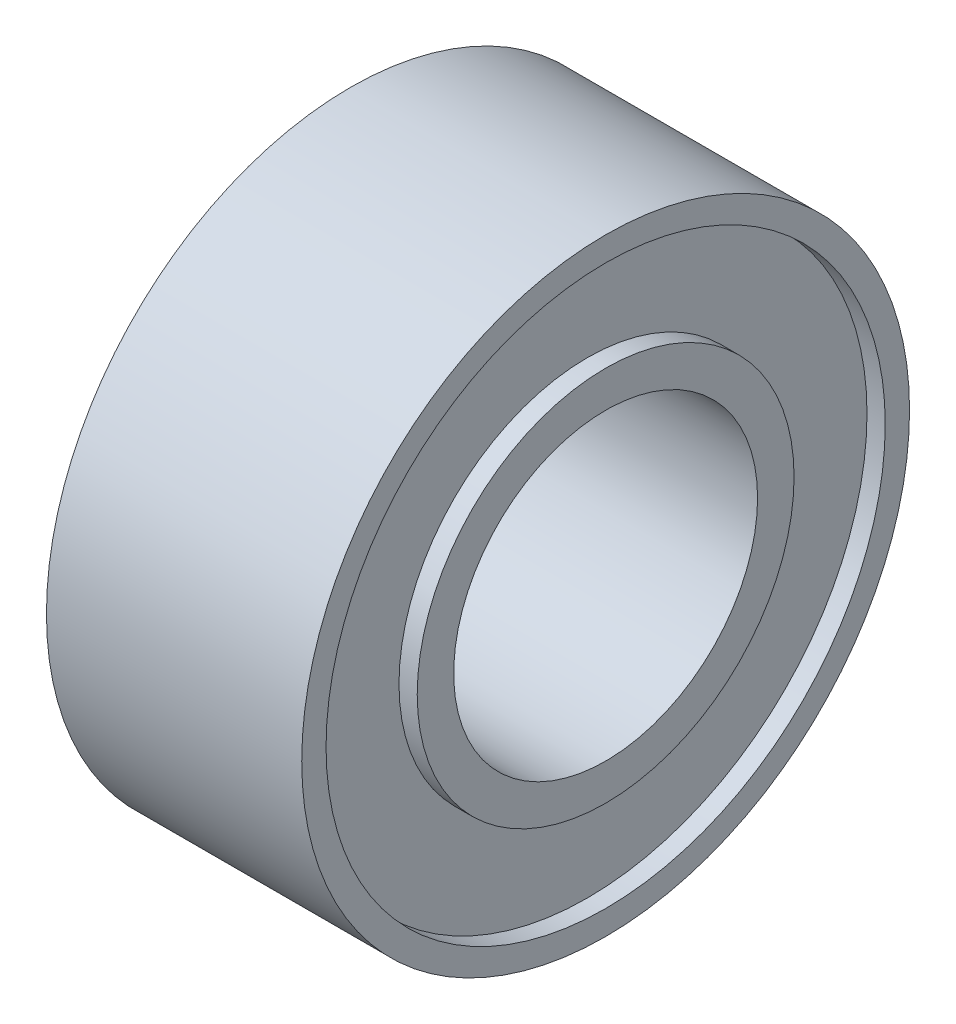
ISO-10303-21;
HEADER;
FILE_DESCRIPTION(('STEP AP214'),'2;1');
FILE_NAME('part.step','',(''),(''),'','','');
FILE_SCHEMA(('AUTOMOTIVE_DESIGN { 1 0 10303 214 1 1 1 1 }'));
ENDSEC;
DATA;
#1=APPLICATION_CONTEXT('core data for automotive mechanical design processes');
#2=APPLICATION_PROTOCOL_DEFINITION('international standard','automotive_design',2000,#1);
#3=PRODUCT_CONTEXT('',#1,'mechanical');
#4=PRODUCT('Part','Part','',(#3));
#5=PRODUCT_RELATED_PRODUCT_CATEGORY('part','',(#4));
#6=PRODUCT_DEFINITION_FORMATION('','',#4);
#7=PRODUCT_DEFINITION_CONTEXT('part definition',#1,'design');
#8=PRODUCT_DEFINITION('design','',#6,#7);
#9=PRODUCT_DEFINITION_SHAPE('','',#8);
#10=(LENGTH_UNIT() NAMED_UNIT(*) SI_UNIT(.MILLI.,.METRE.));
#11=(NAMED_UNIT(*) PLANE_ANGLE_UNIT() SI_UNIT($,.RADIAN.));
#12=(NAMED_UNIT(*) SI_UNIT($,.STERADIAN.) SOLID_ANGLE_UNIT());
#13=UNCERTAINTY_MEASURE_WITH_UNIT(LENGTH_MEASURE(1.E-05),#10,'distance_accuracy_value','');
#14=(GEOMETRIC_REPRESENTATION_CONTEXT(3) GLOBAL_UNCERTAINTY_ASSIGNED_CONTEXT((#13)) GLOBAL_UNIT_ASSIGNED_CONTEXT((#10,
#11,#12)) REPRESENTATION_CONTEXT('',''));
#15=CARTESIAN_POINT('',(0.,0.,0.));
#16=DIRECTION('',(0.,0.,1.));
#17=DIRECTION('',(1.,0.,0.));
#18=AXIS2_PLACEMENT_3D('',#15,#16,#17);
#19=CARTESIAN_POINT('',(-2.1,0.,0.));
#20=DIRECTION('',(1.,0.,0.));
#21=DIRECTION('',(0.,0.,-1.));
#22=AXIS2_PLACEMENT_3D('',#19,#20,#21);
#23=CYLINDRICAL_SURFACE('',#22,3.1);
#24=CARTESIAN_POINT('',(-2.1,0.,0.));
#25=DIRECTION('',(1.,0.,0.));
#26=DIRECTION('',(0.,0.,-1.));
#27=AXIS2_PLACEMENT_3D('',#24,#25,#26);
#28=CIRCLE('',#27,3.1);
#29=CARTESIAN_POINT('',(-2.1,0.,-3.1));
#30=VERTEX_POINT('',#29);
#31=EDGE_CURVE('E10',#30,#30,#28,.T.);
#32=ORIENTED_EDGE('',*,*,#31,.T.);
#33=EDGE_LOOP('',(#32));
#34=FACE_BOUND('',#33,.T.);
#35=CARTESIAN_POINT('',(-1.8,0.,0.));
#36=DIRECTION('',(1.,0.,0.));
#37=DIRECTION('',(0.,0.,-1.));
#38=AXIS2_PLACEMENT_3D('',#35,#36,#37);
#39=CIRCLE('',#38,3.1);
#40=CARTESIAN_POINT('',(-1.8,0.,-3.1));
#41=VERTEX_POINT('',#40);
#42=EDGE_CURVE('E71',#41,#41,#39,.T.);
#43=ORIENTED_EDGE('',*,*,#42,.F.);
#44=EDGE_LOOP('',(#43));
#45=FACE_BOUND('',#44,.T.);
#46=ADVANCED_FACE('F31',(#34,#45),#23,.T.);
#47=CARTESIAN_POINT('',(-2.1,3.1,0.));
#48=DIRECTION('',(-1.,0.,0.));
#49=DIRECTION('',(0.,0.,1.));
#50=AXIS2_PLACEMENT_3D('',#47,#48,#49);
#51=PLANE('',#50);
#52=CARTESIAN_POINT('',(-2.1,0.,0.));
#53=DIRECTION('',(1.,0.,0.));
#54=DIRECTION('',(0.,0.,-1.));
#55=AXIS2_PLACEMENT_3D('',#52,#53,#54);
#56=CIRCLE('',#55,2.5);
#57=CARTESIAN_POINT('',(-2.1,0.,-2.5));
#58=VERTEX_POINT('',#57);
#59=EDGE_CURVE('E37',#58,#58,#56,.T.);
#60=ORIENTED_EDGE('',*,*,#59,.T.);
#61=EDGE_LOOP('',(#60));
#62=FACE_BOUND('',#61,.T.);
#63=ORIENTED_EDGE('',*,*,#31,.F.);
#64=EDGE_LOOP('',(#63));
#65=FACE_BOUND('',#64,.T.);
#66=ADVANCED_FACE('F79',(#62,#65),#51,.T.);
#67=CARTESIAN_POINT('',(-2.1,0.,0.));
#68=DIRECTION('',(1.,0.,0.));
#69=DIRECTION('',(0.,0.,-1.));
#70=AXIS2_PLACEMENT_3D('',#67,#68,#69);
#71=CYLINDRICAL_SURFACE('',#70,2.5);
#72=CARTESIAN_POINT('',(2.1,0.,0.));
#73=DIRECTION('',(1.,0.,0.));
#74=DIRECTION('',(0.,0.,-1.));
#75=AXIS2_PLACEMENT_3D('',#72,#73,#74);
#76=CIRCLE('',#75,2.5);
#77=CARTESIAN_POINT('',(2.1,0.,-2.5));
#78=VERTEX_POINT('',#77);
#79=EDGE_CURVE('E41',#78,#78,#76,.T.);
#80=ORIENTED_EDGE('',*,*,#79,.T.);
#81=EDGE_LOOP('',(#80));
#82=FACE_BOUND('',#81,.T.);
#83=ORIENTED_EDGE('',*,*,#59,.F.);
#84=EDGE_LOOP('',(#83));
#85=FACE_BOUND('',#84,.T.);
#86=ADVANCED_FACE('F83',(#82,#85),#71,.F.);
#87=CARTESIAN_POINT('',(2.1,2.5,0.));
#88=DIRECTION('',(1.,0.,0.));
#89=DIRECTION('',(0.,0.,-1.));
#90=AXIS2_PLACEMENT_3D('',#87,#88,#89);
#91=PLANE('',#90);
#92=CARTESIAN_POINT('',(2.1,0.,0.));
#93=DIRECTION('',(1.,0.,0.));
#94=DIRECTION('',(0.,0.,-1.));
#95=AXIS2_PLACEMENT_3D('',#92,#93,#94);
#96=CIRCLE('',#95,3.1);
#97=CARTESIAN_POINT('',(2.1,0.,-3.1));
#98=VERTEX_POINT('',#97);
#99=EDGE_CURVE('E45',#98,#98,#96,.T.);
#100=ORIENTED_EDGE('',*,*,#99,.T.);
#101=EDGE_LOOP('',(#100));
#102=FACE_BOUND('',#101,.T.);
#103=ORIENTED_EDGE('',*,*,#79,.F.);
#104=EDGE_LOOP('',(#103));
#105=FACE_BOUND('',#104,.T.);
#106=ADVANCED_FACE('F87',(#102,#105),#91,.T.);
#107=CARTESIAN_POINT('',(-2.1,0.,0.));
#108=DIRECTION('',(1.,0.,0.));
#109=DIRECTION('',(0.,0.,-1.));
#110=AXIS2_PLACEMENT_3D('',#107,#108,#109);
#111=CYLINDRICAL_SURFACE('',#110,3.1);
#112=CARTESIAN_POINT('',(1.8,0.,0.));
#113=DIRECTION('',(1.,0.,0.));
#114=DIRECTION('',(0.,0.,-1.));
#115=AXIS2_PLACEMENT_3D('',#112,#113,#114);
#116=CIRCLE('',#115,3.1);
#117=CARTESIAN_POINT('',(1.8,0.,-3.1));
#118=VERTEX_POINT('',#117);
#119=EDGE_CURVE('E50',#118,#118,#116,.T.);
#120=ORIENTED_EDGE('',*,*,#119,.T.);
#121=EDGE_LOOP('',(#120));
#122=FACE_BOUND('',#121,.T.);
#123=ORIENTED_EDGE('',*,*,#99,.F.);
#124=EDGE_LOOP('',(#123));
#125=FACE_BOUND('',#124,.T.);
#126=ADVANCED_FACE('F94',(#122,#125),#111,.T.);
#127=CARTESIAN_POINT('',(1.8,3.1,0.));
#128=DIRECTION('',(1.,0.,0.));
#129=DIRECTION('',(0.,0.,-1.));
#130=AXIS2_PLACEMENT_3D('',#127,#128,#129);
#131=PLANE('',#130);
#132=CARTESIAN_POINT('',(1.8,0.,0.));
#133=DIRECTION('',(1.,0.,0.));
#134=DIRECTION('',(0.,0.,-1.));
#135=AXIS2_PLACEMENT_3D('',#132,#133,#134);
#136=CIRCLE('',#135,4.6);
#137=CARTESIAN_POINT('',(1.8,0.,-4.6));
#138=VERTEX_POINT('',#137);
#139=EDGE_CURVE('E53',#138,#138,#136,.T.);
#140=ORIENTED_EDGE('',*,*,#139,.T.);
#141=EDGE_LOOP('',(#140));
#142=FACE_BOUND('',#141,.T.);
#143=ORIENTED_EDGE('',*,*,#119,.F.);
#144=EDGE_LOOP('',(#143));
#145=FACE_BOUND('',#144,.T.);
#146=ADVANCED_FACE('F98',(#142,#145),#131,.T.);
#147=CARTESIAN_POINT('',(-2.1,0.,0.));
#148=DIRECTION('',(1.,0.,0.));
#149=DIRECTION('',(0.,0.,-1.));
#150=AXIS2_PLACEMENT_3D('',#147,#148,#149);
#151=CYLINDRICAL_SURFACE('',#150,4.6);
#152=CARTESIAN_POINT('',(2.1,0.,0.));
#153=DIRECTION('',(1.,0.,0.));
#154=DIRECTION('',(0.,0.,-1.));
#155=AXIS2_PLACEMENT_3D('',#152,#153,#154);
#156=CIRCLE('',#155,4.6);
#157=CARTESIAN_POINT('',(2.1,0.,-4.6));
#158=VERTEX_POINT('',#157);
#159=EDGE_CURVE('E56',#158,#158,#156,.T.);
#160=ORIENTED_EDGE('',*,*,#159,.T.);
#161=EDGE_LOOP('',(#160));
#162=FACE_BOUND('',#161,.T.);
#163=ORIENTED_EDGE('',*,*,#139,.F.);
#164=EDGE_LOOP('',(#163));
#165=FACE_BOUND('',#164,.T.);
#166=ADVANCED_FACE('F102',(#162,#165),#151,.F.);
#167=CARTESIAN_POINT('',(2.1,4.6,0.));
#168=DIRECTION('',(1.,0.,0.));
#169=DIRECTION('',(0.,0.,-1.));
#170=AXIS2_PLACEMENT_3D('',#167,#168,#169);
#171=PLANE('',#170);
#172=CARTESIAN_POINT('',(2.1,0.,0.));
#173=DIRECTION('',(1.,0.,0.));
#174=DIRECTION('',(0.,0.,-1.));
#175=AXIS2_PLACEMENT_3D('',#172,#173,#174);
#176=CIRCLE('',#175,5.);
#177=CARTESIAN_POINT('',(2.1,0.,-5.));
#178=VERTEX_POINT('',#177);
#179=EDGE_CURVE('E59',#178,#178,#176,.T.);
#180=ORIENTED_EDGE('',*,*,#179,.T.);
#181=EDGE_LOOP('',(#180));
#182=FACE_BOUND('',#181,.T.);
#183=ORIENTED_EDGE('',*,*,#159,.F.);
#184=EDGE_LOOP('',(#183));
#185=FACE_BOUND('',#184,.T.);
#186=ADVANCED_FACE('F106',(#182,#185),#171,.T.);
#187=CARTESIAN_POINT('',(-2.1,0.,0.));
#188=DIRECTION('',(1.,0.,0.));
#189=DIRECTION('',(0.,0.,-1.));
#190=AXIS2_PLACEMENT_3D('',#187,#188,#189);
#191=CYLINDRICAL_SURFACE('',#190,5.);
#192=CARTESIAN_POINT('',(-2.1,0.,0.));
#193=DIRECTION('',(1.,0.,0.));
#194=DIRECTION('',(0.,0.,-1.));
#195=AXIS2_PLACEMENT_3D('',#192,#193,#194);
#196=CIRCLE('',#195,5.);
#197=CARTESIAN_POINT('',(-2.1,0.,-5.));
#198=VERTEX_POINT('',#197);
#199=EDGE_CURVE('E62',#198,#198,#196,.T.);
#200=ORIENTED_EDGE('',*,*,#199,.T.);
#201=EDGE_LOOP('',(#200));
#202=FACE_BOUND('',#201,.T.);
#203=ORIENTED_EDGE('',*,*,#179,.F.);
#204=EDGE_LOOP('',(#203));
#205=FACE_BOUND('',#204,.T.);
#206=ADVANCED_FACE('F110',(#202,#205),#191,.T.);
#207=CARTESIAN_POINT('',(-2.1,5.,0.));
#208=DIRECTION('',(-1.,0.,0.));
#209=DIRECTION('',(0.,0.,1.));
#210=AXIS2_PLACEMENT_3D('',#207,#208,#209);
#211=PLANE('',#210);
#212=CARTESIAN_POINT('',(-2.1,0.,0.));
#213=DIRECTION('',(1.,0.,0.));
#214=DIRECTION('',(0.,0.,-1.));
#215=AXIS2_PLACEMENT_3D('',#212,#213,#214);
#216=CIRCLE('',#215,4.6);
#217=CARTESIAN_POINT('',(-2.1,0.,-4.6));
#218=VERTEX_POINT('',#217);
#219=EDGE_CURVE('E65',#218,#218,#216,.T.);
#220=ORIENTED_EDGE('',*,*,#219,.T.);
#221=EDGE_LOOP('',(#220));
#222=FACE_BOUND('',#221,.T.);
#223=ORIENTED_EDGE('',*,*,#199,.F.);
#224=EDGE_LOOP('',(#223));
#225=FACE_BOUND('',#224,.T.);
#226=ADVANCED_FACE('F114',(#222,#225),#211,.T.);
#227=CARTESIAN_POINT('',(-2.1,0.,0.));
#228=DIRECTION('',(1.,0.,0.));
#229=DIRECTION('',(0.,0.,-1.));
#230=AXIS2_PLACEMENT_3D('',#227,#228,#229);
#231=CYLINDRICAL_SURFACE('',#230,4.6);
#232=CARTESIAN_POINT('',(-1.8,0.,0.));
#233=DIRECTION('',(1.,0.,0.));
#234=DIRECTION('',(0.,0.,-1.));
#235=AXIS2_PLACEMENT_3D('',#232,#233,#234);
#236=CIRCLE('',#235,4.6);
#237=CARTESIAN_POINT('',(-1.8,0.,-4.6));
#238=VERTEX_POINT('',#237);
#239=EDGE_CURVE('E68',#238,#238,#236,.T.);
#240=ORIENTED_EDGE('',*,*,#239,.T.);
#241=EDGE_LOOP('',(#240));
#242=FACE_BOUND('',#241,.T.);
#243=ORIENTED_EDGE('',*,*,#219,.F.);
#244=EDGE_LOOP('',(#243));
#245=FACE_BOUND('',#244,.T.);
#246=ADVANCED_FACE('F118',(#242,#245),#231,.F.);
#247=CARTESIAN_POINT('',(-1.8,4.6,0.));
#248=DIRECTION('',(-1.,0.,0.));
#249=DIRECTION('',(0.,0.,1.));
#250=AXIS2_PLACEMENT_3D('',#247,#248,#249);
#251=PLANE('',#250);
#252=ORIENTED_EDGE('',*,*,#42,.T.);
#253=EDGE_LOOP('',(#252));
#254=FACE_BOUND('',#253,.T.);
#255=ORIENTED_EDGE('',*,*,#239,.F.);
#256=EDGE_LOOP('',(#255));
#257=FACE_BOUND('',#256,.T.);
#258=ADVANCED_FACE('F75',(#254,#257),#251,.T.);
#259=CLOSED_SHELL('',(#46,#66,#86,#106,#126,#146,#166,#186,#206,#226,#246,#258));
#260=MANIFOLD_SOLID_BREP('B2',#259);
#261=ADVANCED_BREP_SHAPE_REPRESENTATION('',(#18,#260),#14);
#262=SHAPE_DEFINITION_REPRESENTATION(#9,#261);
ENDSEC;
END-ISO-10303-21;
